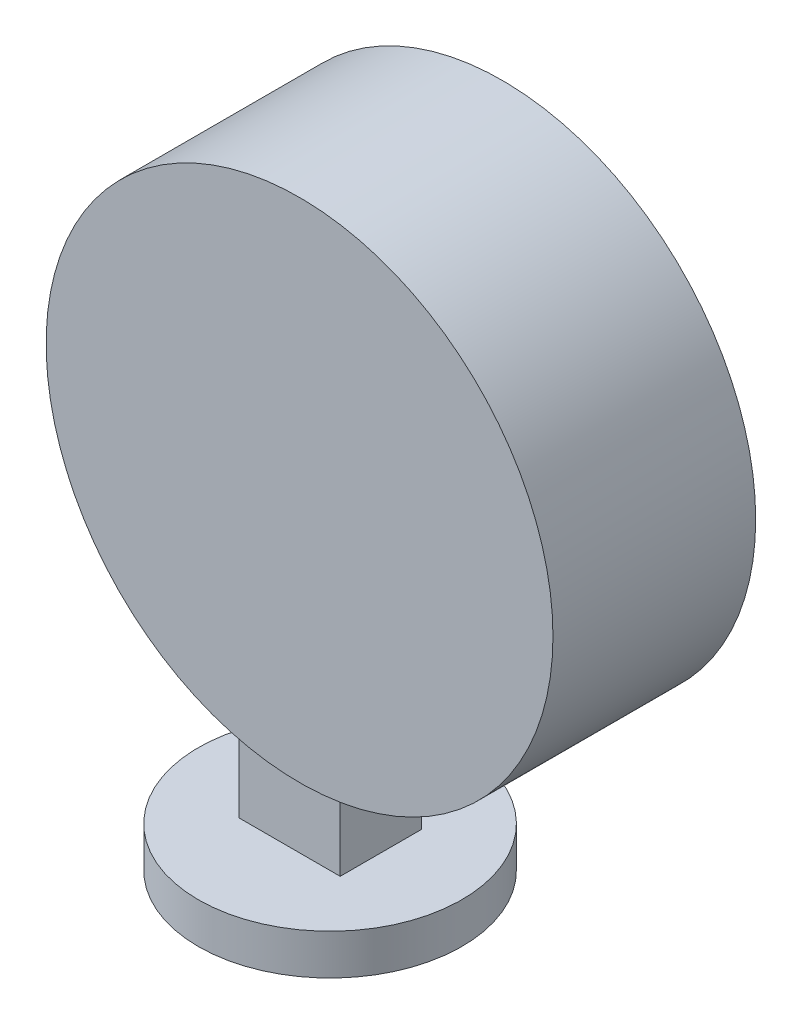
ISO-10303-21;
HEADER;
FILE_DESCRIPTION(('STEP AP214'),'2;1');
FILE_NAME('part.step','',(''),(''),'','','');
FILE_SCHEMA(('AUTOMOTIVE_DESIGN { 1 0 10303 214 1 1 1 1 }'));
ENDSEC;
DATA;
#1=APPLICATION_CONTEXT('core data for automotive mechanical design processes');
#2=APPLICATION_PROTOCOL_DEFINITION('international standard','automotive_design',2000,#1);
#3=PRODUCT_CONTEXT('',#1,'mechanical');
#4=PRODUCT('Part','Part','',(#3));
#5=PRODUCT_RELATED_PRODUCT_CATEGORY('part','',(#4));
#6=PRODUCT_DEFINITION_FORMATION('','',#4);
#7=PRODUCT_DEFINITION_CONTEXT('part definition',#1,'design');
#8=PRODUCT_DEFINITION('design','',#6,#7);
#9=PRODUCT_DEFINITION_SHAPE('','',#8);
#10=(LENGTH_UNIT() NAMED_UNIT(*) SI_UNIT(.MILLI.,.METRE.));
#11=(NAMED_UNIT(*) PLANE_ANGLE_UNIT() SI_UNIT($,.RADIAN.));
#12=(NAMED_UNIT(*) SI_UNIT($,.STERADIAN.) SOLID_ANGLE_UNIT());
#13=UNCERTAINTY_MEASURE_WITH_UNIT(LENGTH_MEASURE(1.E-05),#10,'distance_accuracy_value','');
#14=(GEOMETRIC_REPRESENTATION_CONTEXT(3) GLOBAL_UNCERTAINTY_ASSIGNED_CONTEXT((#13)) GLOBAL_UNIT_ASSIGNED_CONTEXT((#10,
#11,#12)) REPRESENTATION_CONTEXT('',''));
#15=CARTESIAN_POINT('',(0.,0.,0.));
#16=DIRECTION('',(0.,0.,1.));
#17=DIRECTION('',(1.,0.,0.));
#18=AXIS2_PLACEMENT_3D('',#15,#16,#17);
#19=CARTESIAN_POINT('',(0.,2.,0.));
#20=DIRECTION('',(0.,1.,0.));
#21=DIRECTION('',(0.,0.,1.));
#22=AXIS2_PLACEMENT_3D('',#19,#20,#21);
#23=PLANE('',#22);
#24=CARTESIAN_POINT('',(0.,2.,0.));
#25=DIRECTION('',(0.,1.,0.));
#26=DIRECTION('',(0.,0.,1.));
#27=AXIS2_PLACEMENT_3D('',#24,#25,#26);
#28=CIRCLE('',#27,6.5);
#29=CARTESIAN_POINT('',(0.,2.,6.5));
#30=VERTEX_POINT('',#29);
#31=EDGE_CURVE('E53',#30,#30,#28,.T.);
#32=ORIENTED_EDGE('',*,*,#31,.T.);
#33=EDGE_LOOP('',(#32));
#34=FACE_BOUND('',#33,.T.);
#35=DIRECTION('',(1.,0.,0.));
#36=VECTOR('',#35,1.);
#37=CARTESIAN_POINT('',(-2.5,2.,-2.));
#38=LINE('',#37,#36);
#39=CARTESIAN_POINT('',(-2.5,2.,-2.));
#40=VERTEX_POINT('',#39);
#41=CARTESIAN_POINT('',(2.5,2.,-2.));
#42=VERTEX_POINT('',#41);
#43=EDGE_CURVE('E103',#40,#42,#38,.T.);
#44=ORIENTED_EDGE('',*,*,#43,.T.);
#45=DIRECTION('',(0.,0.,1.));
#46=VECTOR('',#45,1.);
#47=CARTESIAN_POINT('',(2.5,2.,-2.));
#48=LINE('',#47,#46);
#49=CARTESIAN_POINT('',(2.5,2.,2.));
#50=VERTEX_POINT('',#49);
#51=EDGE_CURVE('E114',#42,#50,#48,.T.);
#52=ORIENTED_EDGE('',*,*,#51,.T.);
#53=DIRECTION('',(1.,0.,0.));
#54=VECTOR('',#53,1.);
#55=CARTESIAN_POINT('',(-2.5,2.,2.));
#56=LINE('',#55,#54);
#57=CARTESIAN_POINT('',(-2.5,2.,2.));
#58=VERTEX_POINT('',#57);
#59=EDGE_CURVE('E99',#58,#50,#56,.T.);
#60=ORIENTED_EDGE('',*,*,#59,.F.);
#61=DIRECTION('',(0.,0.,1.));
#62=VECTOR('',#61,1.);
#63=CARTESIAN_POINT('',(-2.5,2.,-2.));
#64=LINE('',#63,#62);
#65=EDGE_CURVE('E115',#40,#58,#64,.T.);
#66=ORIENTED_EDGE('',*,*,#65,.F.);
#67=EDGE_LOOP('',(#44,#52,#60,#66));
#68=FACE_BOUND('',#67,.T.);
#69=ADVANCED_FACE('F45',(#34,#68),#23,.T.);
#70=CARTESIAN_POINT('',(0.,2.,0.));
#71=DIRECTION('',(0.,-1.,0.));
#72=DIRECTION('',(0.,0.,-1.));
#73=AXIS2_PLACEMENT_3D('',#70,#71,#72);
#74=CYLINDRICAL_SURFACE('',#73,6.5);
#75=ORIENTED_EDGE('',*,*,#31,.F.);
#76=EDGE_LOOP('',(#75));
#77=FACE_BOUND('',#76,.T.);
#78=CARTESIAN_POINT('',(0.,0.,0.));
#79=DIRECTION('',(0.,1.,0.));
#80=DIRECTION('',(0.,0.,1.));
#81=AXIS2_PLACEMENT_3D('',#78,#79,#80);
#82=CIRCLE('',#81,6.5);
#83=CARTESIAN_POINT('',(0.,0.,6.5));
#84=VERTEX_POINT('',#83);
#85=EDGE_CURVE('E118',#84,#84,#82,.T.);
#86=ORIENTED_EDGE('',*,*,#85,.T.);
#87=EDGE_LOOP('',(#86));
#88=FACE_BOUND('',#87,.T.);
#89=ADVANCED_FACE('F47',(#77,#88),#74,.T.);
#90=CARTESIAN_POINT('',(0.,0.,0.));
#91=DIRECTION('',(0.,1.,0.));
#92=DIRECTION('',(0.,0.,1.));
#93=AXIS2_PLACEMENT_3D('',#90,#91,#92);
#94=PLANE('',#93);
#95=ORIENTED_EDGE('',*,*,#85,.F.);
#96=EDGE_LOOP('',(#95));
#97=FACE_BOUND('',#96,.T.);
#98=ADVANCED_FACE('F125',(#97),#94,.F.);
#99=CARTESIAN_POINT('',(-2.5,2.,-2.));
#100=DIRECTION('',(-1.,0.,0.));
#101=DIRECTION('',(0.,0.,1.));
#102=AXIS2_PLACEMENT_3D('',#99,#100,#101);
#103=PLANE('',#102);
#104=DIRECTION('',(0.,0.,1.));
#105=VECTOR('',#104,1.);
#106=CARTESIAN_POINT('',(-2.5,9.53096766860239,-5.));
#107=LINE('',#106,#105);
#108=CARTESIAN_POINT('',(-2.5,9.53096766860239,-2.));
#109=VERTEX_POINT('',#108);
#110=CARTESIAN_POINT('',(-2.5,9.53096766860239,2.));
#111=VERTEX_POINT('',#110);
#112=EDGE_CURVE('E60',#109,#111,#107,.T.);
#113=ORIENTED_EDGE('',*,*,#112,.F.);
#114=DIRECTION('',(0.,-1.,0.));
#115=VECTOR('',#114,1.);
#116=CARTESIAN_POINT('',(-2.5,2.,-2.));
#117=LINE('',#116,#115);
#118=EDGE_CURVE('E112',#109,#40,#117,.T.);
#119=ORIENTED_EDGE('',*,*,#118,.T.);
#120=ORIENTED_EDGE('',*,*,#65,.T.);
#121=DIRECTION('',(0.,-1.,0.));
#122=VECTOR('',#121,1.);
#123=CARTESIAN_POINT('',(-2.5,2.,2.));
#124=LINE('',#123,#122);
#125=EDGE_CURVE('E101',#111,#58,#124,.T.);
#126=ORIENTED_EDGE('',*,*,#125,.F.);
#127=EDGE_LOOP('',(#113,#119,#120,#126));
#128=FACE_BOUND('',#127,.T.);
#129=ADVANCED_FACE('F127',(#128),#103,.T.);
#130=CARTESIAN_POINT('',(2.5,2.,-2.));
#131=DIRECTION('',(1.,0.,0.));
#132=DIRECTION('',(0.,1.,0.));
#133=AXIS2_PLACEMENT_3D('',#130,#131,#132);
#134=PLANE('',#133);
#135=DIRECTION('',(0.,0.,1.));
#136=VECTOR('',#135,1.);
#137=CARTESIAN_POINT('',(2.5,8.03959938054378,-5.));
#138=LINE('',#137,#136);
#139=CARTESIAN_POINT('',(2.5,8.03959938054378,2.));
#140=VERTEX_POINT('',#139);
#141=CARTESIAN_POINT('',(2.5,8.03959938054378,-2.));
#142=VERTEX_POINT('',#141);
#143=EDGE_CURVE('E87',#140,#142,#138,.F.);
#144=ORIENTED_EDGE('',*,*,#143,.F.);
#145=DIRECTION('',(0.,1.,0.));
#146=VECTOR('',#145,1.);
#147=CARTESIAN_POINT('',(2.5,2.,2.));
#148=LINE('',#147,#146);
#149=EDGE_CURVE('E93',#50,#140,#148,.T.);
#150=ORIENTED_EDGE('',*,*,#149,.F.);
#151=ORIENTED_EDGE('',*,*,#51,.F.);
#152=DIRECTION('',(0.,1.,0.));
#153=VECTOR('',#152,1.);
#154=CARTESIAN_POINT('',(2.5,2.,-2.));
#155=LINE('',#154,#153);
#156=EDGE_CURVE('E67',#42,#142,#155,.T.);
#157=ORIENTED_EDGE('',*,*,#156,.T.);
#158=EDGE_LOOP('',(#144,#150,#151,#157));
#159=FACE_BOUND('',#158,.T.);
#160=ADVANCED_FACE('F92',(#159),#134,.T.);
#161=CARTESIAN_POINT('',(3.49419133100989,17.0058086689901,-2.));
#162=DIRECTION('',(0.,0.,-1.));
#163=DIRECTION('',(-1.,0.,0.));
#164=AXIS2_PLACEMENT_3D('',#161,#162,#163);
#165=PLANE('',#164);
#166=CARTESIAN_POINT('',(3.49419133100987,20.5,-2.));
#167=DIRECTION('',(0.,0.,-1.));
#168=DIRECTION('',(-1.,0.,0.));
#169=AXIS2_PLACEMENT_3D('',#166,#167,#168);
#170=CIRCLE('',#169,12.5);
#171=EDGE_CURVE('E105',#142,#109,#170,.T.);
#172=ORIENTED_EDGE('',*,*,#171,.F.);
#173=ORIENTED_EDGE('',*,*,#156,.F.);
#174=ORIENTED_EDGE('',*,*,#43,.F.);
#175=ORIENTED_EDGE('',*,*,#118,.F.);
#176=EDGE_LOOP('',(#172,#173,#174,#175));
#177=FACE_BOUND('',#176,.T.);
#178=ADVANCED_FACE('F143',(#177),#165,.T.);
#179=CARTESIAN_POINT('',(3.49419133100989,17.0058086689901,2.));
#180=DIRECTION('',(0.,0.,-1.));
#181=DIRECTION('',(-1.,0.,0.));
#182=AXIS2_PLACEMENT_3D('',#179,#180,#181);
#183=PLANE('',#182);
#184=ORIENTED_EDGE('',*,*,#149,.T.);
#185=CARTESIAN_POINT('',(3.49419133100987,20.5,2.));
#186=DIRECTION('',(0.,0.,-1.));
#187=DIRECTION('',(-1.,0.,0.));
#188=AXIS2_PLACEMENT_3D('',#185,#186,#187);
#189=CIRCLE('',#188,12.5);
#190=EDGE_CURVE('E11',#140,#111,#189,.T.);
#191=ORIENTED_EDGE('',*,*,#190,.T.);
#192=ORIENTED_EDGE('',*,*,#125,.T.);
#193=ORIENTED_EDGE('',*,*,#59,.T.);
#194=EDGE_LOOP('',(#184,#191,#192,#193));
#195=FACE_BOUND('',#194,.T.);
#196=ADVANCED_FACE('F97',(#195),#183,.F.);
#197=CARTESIAN_POINT('',(3.49419133100987,20.5,-5.));
#198=DIRECTION('',(0.,0.,1.));
#199=DIRECTION('',(1.,0.,0.));
#200=AXIS2_PLACEMENT_3D('',#197,#198,#199);
#201=CYLINDRICAL_SURFACE('',#200,12.5);
#202=ORIENTED_EDGE('',*,*,#143,.T.);
#203=ORIENTED_EDGE('',*,*,#171,.T.);
#204=ORIENTED_EDGE('',*,*,#112,.T.);
#205=ORIENTED_EDGE('',*,*,#190,.F.);
#206=EDGE_LOOP('',(#202,#203,#204,#205));
#207=FACE_BOUND('',#206,.T.);
#208=CARTESIAN_POINT('',(3.49419133100987,20.5,-5.));
#209=DIRECTION('',(0.,0.,1.));
#210=DIRECTION('',(1.,0.,0.));
#211=AXIS2_PLACEMENT_3D('',#208,#209,#210);
#212=CIRCLE('',#211,12.5);
#213=CARTESIAN_POINT('',(15.9941913310099,20.5,-5.));
#214=VERTEX_POINT('',#213);
#215=EDGE_CURVE('E95',#214,#214,#212,.T.);
#216=ORIENTED_EDGE('',*,*,#215,.T.);
#217=EDGE_LOOP('',(#216));
#218=FACE_BOUND('',#217,.T.);
#219=CARTESIAN_POINT('',(3.49419133100987,20.5,5.));
#220=DIRECTION('',(0.,0.,1.));
#221=DIRECTION('',(1.,0.,0.));
#222=AXIS2_PLACEMENT_3D('',#219,#220,#221);
#223=CIRCLE('',#222,12.5);
#224=CARTESIAN_POINT('',(15.9941913310099,20.5,5.));
#225=VERTEX_POINT('',#224);
#226=EDGE_CURVE('E162',#225,#225,#223,.T.);
#227=ORIENTED_EDGE('',*,*,#226,.F.);
#228=EDGE_LOOP('',(#227));
#229=FACE_BOUND('',#228,.T.);
#230=ADVANCED_FACE('F85',(#207,#218,#229),#201,.T.);
#231=CARTESIAN_POINT('',(3.49419133100987,20.5,-5.));
#232=DIRECTION('',(0.,0.,1.));
#233=DIRECTION('',(1.,0.,0.));
#234=AXIS2_PLACEMENT_3D('',#231,#232,#233);
#235=PLANE('',#234);
#236=ORIENTED_EDGE('',*,*,#215,.F.);
#237=EDGE_LOOP('',(#236));
#238=FACE_BOUND('',#237,.T.);
#239=ADVANCED_FACE('F151',(#238),#235,.F.);
#240=CARTESIAN_POINT('',(3.49419133100987,20.5,5.));
#241=DIRECTION('',(0.,0.,1.));
#242=DIRECTION('',(1.,0.,0.));
#243=AXIS2_PLACEMENT_3D('',#240,#241,#242);
#244=PLANE('',#243);
#245=ORIENTED_EDGE('',*,*,#226,.T.);
#246=EDGE_LOOP('',(#245));
#247=FACE_BOUND('',#246,.T.);
#248=ADVANCED_FACE('F154',(#247),#244,.T.);
#249=CLOSED_SHELL('',(#69,#89,#98,#129,#160,#178,#196,#230,#239,#248));
#250=MANIFOLD_SOLID_BREP('B2',#249);
#251=ADVANCED_BREP_SHAPE_REPRESENTATION('',(#18,#250),#14);
#252=SHAPE_DEFINITION_REPRESENTATION(#9,#251);
ENDSEC;
END-ISO-10303-21;
